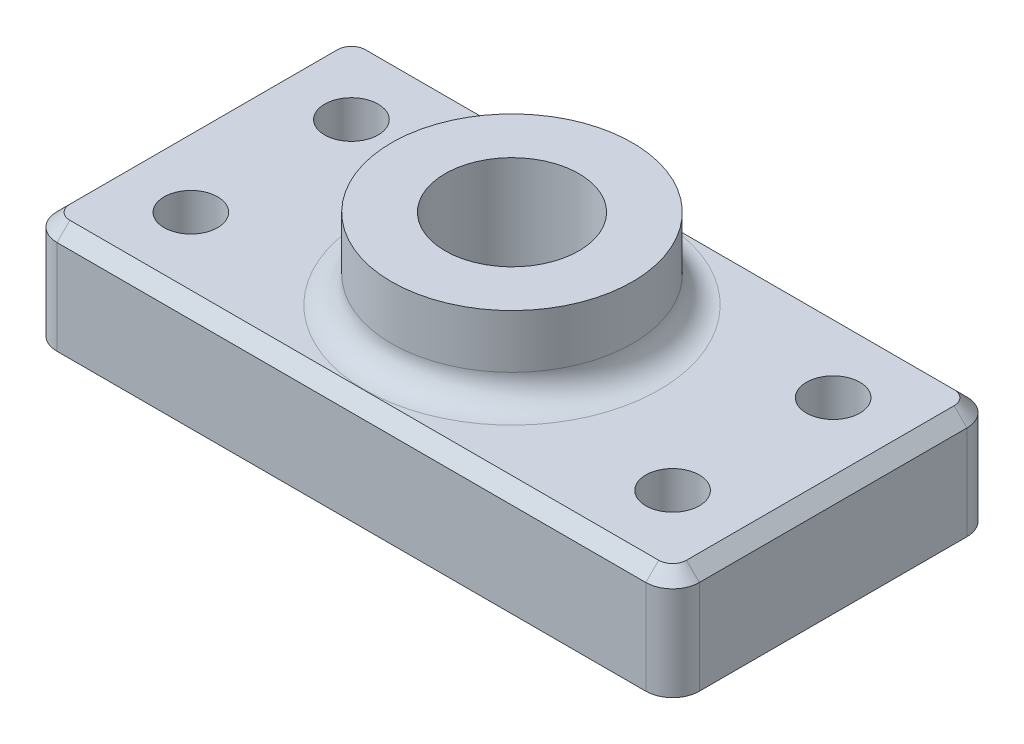
ISO-10303-21;
HEADER;
FILE_DESCRIPTION(('STEP AP214'),'2;1');
FILE_NAME('part.step','',(''),(''),'','','');
FILE_SCHEMA(('AUTOMOTIVE_DESIGN { 1 0 10303 214 1 1 1 1 }'));
ENDSEC;
DATA;
#1=APPLICATION_CONTEXT('core data for automotive mechanical design processes');
#2=APPLICATION_PROTOCOL_DEFINITION('international standard','automotive_design',2000,#1);
#3=PRODUCT_CONTEXT('',#1,'mechanical');
#4=PRODUCT('Part','Part','',(#3));
#5=PRODUCT_RELATED_PRODUCT_CATEGORY('part','',(#4));
#6=PRODUCT_DEFINITION_FORMATION('','',#4);
#7=PRODUCT_DEFINITION_CONTEXT('part definition',#1,'design');
#8=PRODUCT_DEFINITION('design','',#6,#7);
#9=PRODUCT_DEFINITION_SHAPE('','',#8);
#10=(LENGTH_UNIT() NAMED_UNIT(*) SI_UNIT(.MILLI.,.METRE.));
#11=(NAMED_UNIT(*) PLANE_ANGLE_UNIT() SI_UNIT($,.RADIAN.));
#12=(NAMED_UNIT(*) SI_UNIT($,.STERADIAN.) SOLID_ANGLE_UNIT());
#13=UNCERTAINTY_MEASURE_WITH_UNIT(LENGTH_MEASURE(1.E-05),#10,'distance_accuracy_value','');
#14=(GEOMETRIC_REPRESENTATION_CONTEXT(3) GLOBAL_UNCERTAINTY_ASSIGNED_CONTEXT((#13)) GLOBAL_UNIT_ASSIGNED_CONTEXT((#10,
#11,#12)) REPRESENTATION_CONTEXT('',''));
#15=CARTESIAN_POINT('',(0.,0.,0.));
#16=DIRECTION('',(0.,0.,1.));
#17=DIRECTION('',(1.,0.,0.));
#18=AXIS2_PLACEMENT_3D('',#15,#16,#17);
#19=CARTESIAN_POINT('',(0.,1000.,0.));
#20=DIRECTION('',(0.,1.,0.));
#21=DIRECTION('',(0.,0.,1.));
#22=AXIS2_PLACEMENT_3D('',#19,#20,#21);
#23=PLANE('',#22);
#24=CARTESIAN_POINT('',(2750.,1000.,-1250.));
#25=DIRECTION('',(0.,1.,0.));
#26=DIRECTION('',(0.,0.,1.));
#27=AXIS2_PLACEMENT_3D('',#24,#25,#26);
#28=CIRCLE('',#27,130.000000000001);
#29=CARTESIAN_POINT('',(2880.,1000.,-1250.));
#30=VERTEX_POINT('',#29);
#31=CARTESIAN_POINT('',(2750.,1000.,-1380.));
#32=VERTEX_POINT('',#31);
#33=EDGE_CURVE('E236',#30,#32,#28,.T.);
#34=ORIENTED_EDGE('',*,*,#33,.T.);
#35=DIRECTION('',(-1.,0.,0.));
#36=VECTOR('',#35,1.);
#37=CARTESIAN_POINT('',(-2750.,1000.,-1380.));
#38=LINE('',#37,#36);
#39=CARTESIAN_POINT('',(-2750.,1000.,-1380.));
#40=VERTEX_POINT('',#39);
#41=EDGE_CURVE('E242',#32,#40,#38,.T.);
#42=ORIENTED_EDGE('',*,*,#41,.T.);
#43=CARTESIAN_POINT('',(-2750.,1000.,-1250.));
#44=DIRECTION('',(0.,1.,0.));
#45=DIRECTION('',(0.,0.,1.));
#46=AXIS2_PLACEMENT_3D('',#43,#44,#45);
#47=CIRCLE('',#46,130.000000000001);
#48=CARTESIAN_POINT('',(-2880.,1000.,-1250.));
#49=VERTEX_POINT('',#48);
#50=EDGE_CURVE('E239',#40,#49,#47,.T.);
#51=ORIENTED_EDGE('',*,*,#50,.T.);
#52=DIRECTION('',(0.,0.,1.));
#53=VECTOR('',#52,1.);
#54=CARTESIAN_POINT('',(-2880.,1000.,1250.));
#55=LINE('',#54,#53);
#56=CARTESIAN_POINT('',(-2880.,1000.,1250.));
#57=VERTEX_POINT('',#56);
#58=EDGE_CURVE('E233',#49,#57,#55,.T.);
#59=ORIENTED_EDGE('',*,*,#58,.T.);
#60=CARTESIAN_POINT('',(-2750.,1000.,1250.));
#61=DIRECTION('',(0.,1.,0.));
#62=DIRECTION('',(0.,0.,1.));
#63=AXIS2_PLACEMENT_3D('',#60,#61,#62);
#64=CIRCLE('',#63,130.000000000001);
#65=CARTESIAN_POINT('',(-2750.,1000.,1380.));
#66=VERTEX_POINT('',#65);
#67=EDGE_CURVE('E227',#57,#66,#64,.T.);
#68=ORIENTED_EDGE('',*,*,#67,.T.);
#69=DIRECTION('',(1.,0.,0.));
#70=VECTOR('',#69,1.);
#71=CARTESIAN_POINT('',(2750.,1000.,1380.));
#72=LINE('',#71,#70);
#73=CARTESIAN_POINT('',(2750.,1000.,1380.));
#74=VERTEX_POINT('',#73);
#75=EDGE_CURVE('E221',#66,#74,#72,.T.);
#76=ORIENTED_EDGE('',*,*,#75,.T.);
#77=CARTESIAN_POINT('',(2750.,1000.,1250.));
#78=DIRECTION('',(0.,1.,0.));
#79=DIRECTION('',(0.,0.,1.));
#80=AXIS2_PLACEMENT_3D('',#77,#78,#79);
#81=CIRCLE('',#80,130.000000000001);
#82=CARTESIAN_POINT('',(2880.,1000.,1250.));
#83=VERTEX_POINT('',#82);
#84=EDGE_CURVE('E224',#74,#83,#81,.T.);
#85=ORIENTED_EDGE('',*,*,#84,.T.);
#86=DIRECTION('',(0.,0.,-1.));
#87=VECTOR('',#86,1.);
#88=CARTESIAN_POINT('',(2880.,1000.,-1250.));
#89=LINE('',#88,#87);
#90=EDGE_CURVE('E230',#83,#30,#89,.T.);
#91=ORIENTED_EDGE('',*,*,#90,.T.);
#92=EDGE_LOOP('',(#34,#42,#51,#59,#68,#76,#85,#91));
#93=FACE_BOUND('',#92,.T.);
#94=CARTESIAN_POINT('',(0.,1000.,0.));
#95=DIRECTION('',(0.,1.,0.));
#96=DIRECTION('',(0.,0.,1.));
#97=AXIS2_PLACEMENT_3D('',#94,#95,#96);
#98=CIRCLE('',#97,1375.);
#99=CARTESIAN_POINT('',(0.,1000.,1375.));
#100=VERTEX_POINT('',#99);
#101=EDGE_CURVE('E191',#100,#100,#98,.F.);
#102=ORIENTED_EDGE('',*,*,#101,.T.);
#103=EDGE_LOOP('',(#102));
#104=FACE_BOUND('',#103,.T.);
#105=CARTESIAN_POINT('',(-2250.,1000.,750.));
#106=DIRECTION('',(0.,1.,0.));
#107=DIRECTION('',(0.,0.,-1.));
#108=AXIS2_PLACEMENT_3D('',#105,#106,#107);
#109=CIRCLE('',#108,250.);
#110=CARTESIAN_POINT('',(-2250.,1000.,500.));
#111=VERTEX_POINT('',#110);
#112=EDGE_CURVE('E323',#111,#111,#109,.T.);
#113=ORIENTED_EDGE('',*,*,#112,.F.);
#114=EDGE_LOOP('',(#113));
#115=FACE_BOUND('',#114,.T.);
#116=CARTESIAN_POINT('',(-2250.,1000.,-750.));
#117=DIRECTION('',(0.,1.,0.));
#118=DIRECTION('',(0.,0.,1.));
#119=AXIS2_PLACEMENT_3D('',#116,#117,#118);
#120=CIRCLE('',#119,250.);
#121=CARTESIAN_POINT('',(-2250.,1000.,-500.));
#122=VERTEX_POINT('',#121);
#123=EDGE_CURVE('E169',#122,#122,#120,.T.);
#124=ORIENTED_EDGE('',*,*,#123,.F.);
#125=EDGE_LOOP('',(#124));
#126=FACE_BOUND('',#125,.T.);
#127=CARTESIAN_POINT('',(2250.,1000.,-749.999999999998));
#128=DIRECTION('',(0.,1.,0.));
#129=DIRECTION('',(0.,0.,-1.));
#130=AXIS2_PLACEMENT_3D('',#127,#128,#129);
#131=CIRCLE('',#130,250.);
#132=CARTESIAN_POINT('',(2250.,1000.,-999.999999999998));
#133=VERTEX_POINT('',#132);
#134=EDGE_CURVE('E331',#133,#133,#131,.T.);
#135=ORIENTED_EDGE('',*,*,#134,.F.);
#136=EDGE_LOOP('',(#135));
#137=FACE_BOUND('',#136,.T.);
#138=CARTESIAN_POINT('',(2250.,1000.,749.999999999998));
#139=DIRECTION('',(0.,1.,0.));
#140=DIRECTION('',(0.,0.,1.));
#141=AXIS2_PLACEMENT_3D('',#138,#139,#140);
#142=CIRCLE('',#141,250.);
#143=CARTESIAN_POINT('',(2250.,1000.,999.999999999998));
#144=VERTEX_POINT('',#143);
#145=EDGE_CURVE('E315',#144,#144,#142,.T.);
#146=ORIENTED_EDGE('',*,*,#145,.F.);
#147=EDGE_LOOP('',(#146));
#148=FACE_BOUND('',#147,.T.);
#149=ADVANCED_FACE('F44',(#93,#104,#115,#126,#137,#148),#23,.T.);
#150=CARTESIAN_POINT('',(0.,0.,0.));
#151=DIRECTION('',(0.,1.,0.));
#152=DIRECTION('',(0.,0.,1.));
#153=AXIS2_PLACEMENT_3D('',#150,#151,#152);
#154=PLANE('',#153);
#155=CARTESIAN_POINT('',(0.,0.,0.));
#156=DIRECTION('',(0.,1.,0.));
#157=DIRECTION('',(0.,0.,1.));
#158=AXIS2_PLACEMENT_3D('',#155,#156,#157);
#159=CIRCLE('',#158,625.);
#160=CARTESIAN_POINT('',(0.,0.,625.));
#161=VERTEX_POINT('',#160);
#162=EDGE_CURVE('E296',#161,#161,#159,.T.);
#163=ORIENTED_EDGE('',*,*,#162,.T.);
#164=EDGE_LOOP('',(#163));
#165=FACE_BOUND('',#164,.T.);
#166=DIRECTION('',(0.,0.,1.));
#167=VECTOR('',#166,1.);
#168=CARTESIAN_POINT('',(-3000.,0.,1500.));
#169=LINE('',#168,#167);
#170=CARTESIAN_POINT('',(-3000.,0.,-1250.));
#171=VERTEX_POINT('',#170);
#172=CARTESIAN_POINT('',(-3000.,0.,1250.));
#173=VERTEX_POINT('',#172);
#174=EDGE_CURVE('E141',#171,#173,#169,.T.);
#175=ORIENTED_EDGE('',*,*,#174,.F.);
#176=CARTESIAN_POINT('',(-2750.,0.,-1250.));
#177=DIRECTION('',(0.,1.,0.));
#178=DIRECTION('',(0.,0.,1.));
#179=AXIS2_PLACEMENT_3D('',#176,#177,#178);
#180=CIRCLE('',#179,250.);
#181=CARTESIAN_POINT('',(-2750.,0.,-1500.));
#182=VERTEX_POINT('',#181);
#183=EDGE_CURVE('E152',#171,#182,#180,.F.);
#184=ORIENTED_EDGE('',*,*,#183,.T.);
#185=DIRECTION('',(-1.,0.,0.));
#186=VECTOR('',#185,1.);
#187=CARTESIAN_POINT('',(3000.,0.,-1500.));
#188=LINE('',#187,#186);
#189=CARTESIAN_POINT('',(2750.,0.,-1500.));
#190=VERTEX_POINT('',#189);
#191=EDGE_CURVE('E184',#190,#182,#188,.T.);
#192=ORIENTED_EDGE('',*,*,#191,.F.);
#193=CARTESIAN_POINT('',(2750.,0.,-1250.));
#194=DIRECTION('',(0.,1.,0.));
#195=DIRECTION('',(0.,0.,1.));
#196=AXIS2_PLACEMENT_3D('',#193,#194,#195);
#197=CIRCLE('',#196,250.);
#198=CARTESIAN_POINT('',(3000.,0.,-1250.));
#199=VERTEX_POINT('',#198);
#200=EDGE_CURVE('E161',#190,#199,#197,.F.);
#201=ORIENTED_EDGE('',*,*,#200,.T.);
#202=DIRECTION('',(0.,0.,-1.));
#203=VECTOR('',#202,1.);
#204=CARTESIAN_POINT('',(3000.,0.,1500.));
#205=LINE('',#204,#203);
#206=CARTESIAN_POINT('',(3000.,0.,1250.));
#207=VERTEX_POINT('',#206);
#208=EDGE_CURVE('E174',#207,#199,#205,.T.);
#209=ORIENTED_EDGE('',*,*,#208,.F.);
#210=CARTESIAN_POINT('',(2750.,0.,1250.));
#211=DIRECTION('',(0.,1.,0.));
#212=DIRECTION('',(0.,0.,1.));
#213=AXIS2_PLACEMENT_3D('',#210,#211,#212);
#214=CIRCLE('',#213,250.);
#215=CARTESIAN_POINT('',(2750.,0.,1500.));
#216=VERTEX_POINT('',#215);
#217=EDGE_CURVE('E199',#207,#216,#214,.F.);
#218=ORIENTED_EDGE('',*,*,#217,.T.);
#219=DIRECTION('',(1.,0.,0.));
#220=VECTOR('',#219,1.);
#221=CARTESIAN_POINT('',(3000.,0.,1500.));
#222=LINE('',#221,#220);
#223=CARTESIAN_POINT('',(-2750.,0.,1500.));
#224=VERTEX_POINT('',#223);
#225=EDGE_CURVE('E168',#224,#216,#222,.T.);
#226=ORIENTED_EDGE('',*,*,#225,.F.);
#227=CARTESIAN_POINT('',(-2750.,0.,1250.));
#228=DIRECTION('',(0.,1.,0.));
#229=DIRECTION('',(0.,0.,1.));
#230=AXIS2_PLACEMENT_3D('',#227,#228,#229);
#231=CIRCLE('',#230,250.);
#232=EDGE_CURVE('E148',#224,#173,#231,.F.);
#233=ORIENTED_EDGE('',*,*,#232,.T.);
#234=EDGE_LOOP('',(#175,#184,#192,#201,#209,#218,#226,#233));
#235=FACE_BOUND('',#234,.T.);
#236=CARTESIAN_POINT('',(-2250.,0.,-750.));
#237=DIRECTION('',(0.,1.,0.));
#238=DIRECTION('',(0.,0.,1.));
#239=AXIS2_PLACEMENT_3D('',#236,#237,#238);
#240=CIRCLE('',#239,250.);
#241=CARTESIAN_POINT('',(-2250.,0.,-500.));
#242=VERTEX_POINT('',#241);
#243=EDGE_CURVE('E177',#242,#242,#240,.T.);
#244=ORIENTED_EDGE('',*,*,#243,.T.);
#245=EDGE_LOOP('',(#244));
#246=FACE_BOUND('',#245,.T.);
#247=CARTESIAN_POINT('',(2250.,0.,-749.999999999998));
#248=DIRECTION('',(0.,1.,0.));
#249=DIRECTION('',(0.,0.,-1.));
#250=AXIS2_PLACEMENT_3D('',#247,#248,#249);
#251=CIRCLE('',#250,250.);
#252=CARTESIAN_POINT('',(2250.,0.,-999.999999999998));
#253=VERTEX_POINT('',#252);
#254=EDGE_CURVE('E327',#253,#253,#251,.T.);
#255=ORIENTED_EDGE('',*,*,#254,.T.);
#256=EDGE_LOOP('',(#255));
#257=FACE_BOUND('',#256,.T.);
#258=CARTESIAN_POINT('',(-2250.,0.,750.));
#259=DIRECTION('',(0.,1.,0.));
#260=DIRECTION('',(0.,0.,-1.));
#261=AXIS2_PLACEMENT_3D('',#258,#259,#260);
#262=CIRCLE('',#261,250.);
#263=CARTESIAN_POINT('',(-2250.,0.,500.));
#264=VERTEX_POINT('',#263);
#265=EDGE_CURVE('E319',#264,#264,#262,.T.);
#266=ORIENTED_EDGE('',*,*,#265,.T.);
#267=EDGE_LOOP('',(#266));
#268=FACE_BOUND('',#267,.T.);
#269=CARTESIAN_POINT('',(2250.,0.,749.999999999998));
#270=DIRECTION('',(0.,1.,0.));
#271=DIRECTION('',(0.,0.,1.));
#272=AXIS2_PLACEMENT_3D('',#269,#270,#271);
#273=CIRCLE('',#272,250.);
#274=CARTESIAN_POINT('',(2250.,0.,999.999999999998));
#275=VERTEX_POINT('',#274);
#276=EDGE_CURVE('E314',#275,#275,#273,.T.);
#277=ORIENTED_EDGE('',*,*,#276,.T.);
#278=EDGE_LOOP('',(#277));
#279=FACE_BOUND('',#278,.T.);
#280=ADVANCED_FACE('F163',(#165,#235,#246,#257,#268,#279),#154,.F.);
#281=CARTESIAN_POINT('',(-3000.,1000.,1500.));
#282=DIRECTION('',(1.,0.,0.));
#283=DIRECTION('',(0.,0.,-1.));
#284=AXIS2_PLACEMENT_3D('',#281,#282,#283);
#285=PLANE('',#284);
#286=DIRECTION('',(0.,-1.,0.));
#287=VECTOR('',#286,1.);
#288=CARTESIAN_POINT('',(-3000.,1000.,1250.));
#289=LINE('',#288,#287);
#290=CARTESIAN_POINT('',(-3000.,880.000000000001,1250.));
#291=VERTEX_POINT('',#290);
#292=EDGE_CURVE('E149',#173,#291,#289,.F.);
#293=ORIENTED_EDGE('',*,*,#292,.T.);
#294=DIRECTION('',(0.,0.,-1.));
#295=VECTOR('',#294,1.);
#296=CARTESIAN_POINT('',(-3000.,880.000000000001,-1250.));
#297=LINE('',#296,#295);
#298=CARTESIAN_POINT('',(-3000.,880.000000000001,-1250.));
#299=VERTEX_POINT('',#298);
#300=EDGE_CURVE('E144',#291,#299,#297,.T.);
#301=ORIENTED_EDGE('',*,*,#300,.T.);
#302=DIRECTION('',(0.,-1.,0.));
#303=VECTOR('',#302,1.);
#304=CARTESIAN_POINT('',(-3000.,1000.,-1250.));
#305=LINE('',#304,#303);
#306=EDGE_CURVE('E136',#299,#171,#305,.T.);
#307=ORIENTED_EDGE('',*,*,#306,.T.);
#308=ORIENTED_EDGE('',*,*,#174,.T.);
#309=EDGE_LOOP('',(#293,#301,#307,#308));
#310=FACE_BOUND('',#309,.T.);
#311=ADVANCED_FACE('F139',(#310),#285,.F.);
#312=CARTESIAN_POINT('',(3000.,1000.,1500.));
#313=DIRECTION('',(0.,0.,-1.));
#314=DIRECTION('',(-1.,0.,0.));
#315=AXIS2_PLACEMENT_3D('',#312,#313,#314);
#316=PLANE('',#315);
#317=DIRECTION('',(0.,-1.,0.));
#318=VECTOR('',#317,1.);
#319=CARTESIAN_POINT('',(2750.,1000.,1500.));
#320=LINE('',#319,#318);
#321=CARTESIAN_POINT('',(2750.,880.000000000001,1500.));
#322=VERTEX_POINT('',#321);
#323=EDGE_CURVE('E218',#216,#322,#320,.F.);
#324=ORIENTED_EDGE('',*,*,#323,.T.);
#325=DIRECTION('',(-1.,0.,0.));
#326=VECTOR('',#325,1.);
#327=CARTESIAN_POINT('',(-2750.,880.000000000001,1500.));
#328=LINE('',#327,#326);
#329=CARTESIAN_POINT('',(-2750.,880.000000000001,1500.));
#330=VERTEX_POINT('',#329);
#331=EDGE_CURVE('E11',#322,#330,#328,.T.);
#332=ORIENTED_EDGE('',*,*,#331,.T.);
#333=DIRECTION('',(0.,-1.,0.));
#334=VECTOR('',#333,1.);
#335=CARTESIAN_POINT('',(-2750.,1000.,1500.));
#336=LINE('',#335,#334);
#337=EDGE_CURVE('E215',#330,#224,#336,.T.);
#338=ORIENTED_EDGE('',*,*,#337,.T.);
#339=ORIENTED_EDGE('',*,*,#225,.T.);
#340=EDGE_LOOP('',(#324,#332,#338,#339));
#341=FACE_BOUND('',#340,.T.);
#342=ADVANCED_FACE('F373',(#341),#316,.F.);
#343=CARTESIAN_POINT('',(3000.,1000.,1500.));
#344=DIRECTION('',(-1.,0.,0.));
#345=DIRECTION('',(0.,0.,1.));
#346=AXIS2_PLACEMENT_3D('',#343,#344,#345);
#347=PLANE('',#346);
#348=DIRECTION('',(0.,-1.,0.));
#349=VECTOR('',#348,1.);
#350=CARTESIAN_POINT('',(3000.,1000.,-1250.));
#351=LINE('',#350,#349);
#352=CARTESIAN_POINT('',(3000.,880.000000000001,-1250.));
#353=VERTEX_POINT('',#352);
#354=EDGE_CURVE('E211',#199,#353,#351,.F.);
#355=ORIENTED_EDGE('',*,*,#354,.T.);
#356=DIRECTION('',(0.,0.,1.));
#357=VECTOR('',#356,1.);
#358=CARTESIAN_POINT('',(3000.,880.000000000001,1250.));
#359=LINE('',#358,#357);
#360=CARTESIAN_POINT('',(3000.,880.000000000001,1250.));
#361=VERTEX_POINT('',#360);
#362=EDGE_CURVE('E258',#353,#361,#359,.T.);
#363=ORIENTED_EDGE('',*,*,#362,.T.);
#364=DIRECTION('',(0.,-1.,0.));
#365=VECTOR('',#364,1.);
#366=CARTESIAN_POINT('',(3000.,1000.,1250.));
#367=LINE('',#366,#365);
#368=EDGE_CURVE('E208',#361,#207,#367,.T.);
#369=ORIENTED_EDGE('',*,*,#368,.T.);
#370=ORIENTED_EDGE('',*,*,#208,.T.);
#371=EDGE_LOOP('',(#355,#363,#369,#370));
#372=FACE_BOUND('',#371,.T.);
#373=ADVANCED_FACE('F369',(#372),#347,.F.);
#374=CARTESIAN_POINT('',(3000.,1000.,-1500.));
#375=DIRECTION('',(0.,0.,1.));
#376=DIRECTION('',(1.,0.,0.));
#377=AXIS2_PLACEMENT_3D('',#374,#375,#376);
#378=PLANE('',#377);
#379=DIRECTION('',(0.,-1.,0.));
#380=VECTOR('',#379,1.);
#381=CARTESIAN_POINT('',(-2750.,1000.,-1500.));
#382=LINE('',#381,#380);
#383=CARTESIAN_POINT('',(-2750.,880.000000000001,-1500.));
#384=VERTEX_POINT('',#383);
#385=EDGE_CURVE('E155',#182,#384,#382,.F.);
#386=ORIENTED_EDGE('',*,*,#385,.T.);
#387=DIRECTION('',(1.,0.,0.));
#388=VECTOR('',#387,1.);
#389=CARTESIAN_POINT('',(2750.,880.000000000001,-1500.));
#390=LINE('',#389,#388);
#391=CARTESIAN_POINT('',(2750.,880.000000000001,-1500.));
#392=VERTEX_POINT('',#391);
#393=EDGE_CURVE('E246',#384,#392,#390,.T.);
#394=ORIENTED_EDGE('',*,*,#393,.T.);
#395=DIRECTION('',(0.,-1.,0.));
#396=VECTOR('',#395,1.);
#397=CARTESIAN_POINT('',(2750.,1000.,-1500.));
#398=LINE('',#397,#396);
#399=EDGE_CURVE('E160',#392,#190,#398,.T.);
#400=ORIENTED_EDGE('',*,*,#399,.T.);
#401=ORIENTED_EDGE('',*,*,#191,.T.);
#402=EDGE_LOOP('',(#386,#394,#400,#401));
#403=FACE_BOUND('',#402,.T.);
#404=ADVANCED_FACE('F354',(#403),#378,.F.);
#405=CARTESIAN_POINT('',(-2250.,1000.,-750.));
#406=DIRECTION('',(0.,-1.,0.));
#407=DIRECTION('',(0.,0.,-1.));
#408=AXIS2_PLACEMENT_3D('',#405,#406,#407);
#409=CYLINDRICAL_SURFACE('',#408,250.);
#410=ORIENTED_EDGE('',*,*,#123,.T.);
#411=EDGE_LOOP('',(#410));
#412=FACE_BOUND('',#411,.T.);
#413=ORIENTED_EDGE('',*,*,#243,.F.);
#414=EDGE_LOOP('',(#413));
#415=FACE_BOUND('',#414,.T.);
#416=ADVANCED_FACE('F344',(#412,#415),#409,.F.);
#417=CARTESIAN_POINT('',(2250.,1000.,-749.999999999998));
#418=DIRECTION('',(0.,-1.,0.));
#419=DIRECTION('',(0.,0.,-1.));
#420=AXIS2_PLACEMENT_3D('',#417,#418,#419);
#421=CYLINDRICAL_SURFACE('',#420,250.);
#422=ORIENTED_EDGE('',*,*,#134,.T.);
#423=EDGE_LOOP('',(#422));
#424=FACE_BOUND('',#423,.T.);
#425=ORIENTED_EDGE('',*,*,#254,.F.);
#426=EDGE_LOOP('',(#425));
#427=FACE_BOUND('',#426,.T.);
#428=ADVANCED_FACE('F341',(#424,#427),#421,.F.);
#429=CARTESIAN_POINT('',(-2250.,1000.,750.));
#430=DIRECTION('',(0.,-1.,0.));
#431=DIRECTION('',(0.,0.,-1.));
#432=AXIS2_PLACEMENT_3D('',#429,#430,#431);
#433=CYLINDRICAL_SURFACE('',#432,250.);
#434=ORIENTED_EDGE('',*,*,#112,.T.);
#435=EDGE_LOOP('',(#434));
#436=FACE_BOUND('',#435,.T.);
#437=ORIENTED_EDGE('',*,*,#265,.F.);
#438=EDGE_LOOP('',(#437));
#439=FACE_BOUND('',#438,.T.);
#440=ADVANCED_FACE('F343',(#436,#439),#433,.F.);
#441=CARTESIAN_POINT('',(2250.,1000.,749.999999999998));
#442=DIRECTION('',(0.,-1.,0.));
#443=DIRECTION('',(0.,0.,-1.));
#444=AXIS2_PLACEMENT_3D('',#441,#442,#443);
#445=CYLINDRICAL_SURFACE('',#444,250.);
#446=ORIENTED_EDGE('',*,*,#145,.T.);
#447=EDGE_LOOP('',(#446));
#448=FACE_BOUND('',#447,.T.);
#449=ORIENTED_EDGE('',*,*,#276,.F.);
#450=EDGE_LOOP('',(#449));
#451=FACE_BOUND('',#450,.T.);
#452=ADVANCED_FACE('F351',(#448,#451),#445,.F.);
#453=CARTESIAN_POINT('',(0.,1750.,0.));
#454=DIRECTION('',(0.,1.,0.));
#455=DIRECTION('',(0.,0.,1.));
#456=AXIS2_PLACEMENT_3D('',#453,#454,#455);
#457=PLANE('',#456);
#458=CARTESIAN_POINT('',(0.,1750.,0.));
#459=DIRECTION('',(0.,1.,0.));
#460=DIRECTION('',(0.,0.,1.));
#461=AXIS2_PLACEMENT_3D('',#458,#459,#460);
#462=CIRCLE('',#461,1125.);
#463=CARTESIAN_POINT('',(0.,1750.,1125.));
#464=VERTEX_POINT('',#463);
#465=EDGE_CURVE('E308',#464,#464,#462,.T.);
#466=ORIENTED_EDGE('',*,*,#465,.T.);
#467=EDGE_LOOP('',(#466));
#468=FACE_BOUND('',#467,.T.);
#469=CARTESIAN_POINT('',(0.,1750.,0.));
#470=DIRECTION('',(0.,1.,0.));
#471=DIRECTION('',(0.,0.,1.));
#472=AXIS2_PLACEMENT_3D('',#469,#470,#471);
#473=CIRCLE('',#472,625.);
#474=CARTESIAN_POINT('',(0.,1750.,625.));
#475=VERTEX_POINT('',#474);
#476=EDGE_CURVE('E302',#475,#475,#473,.T.);
#477=ORIENTED_EDGE('',*,*,#476,.F.);
#478=EDGE_LOOP('',(#477));
#479=FACE_BOUND('',#478,.T.);
#480=ADVANCED_FACE('F503',(#468,#479),#457,.T.);
#481=CARTESIAN_POINT('',(0.,1750.,0.));
#482=DIRECTION('',(0.,-1.,0.));
#483=DIRECTION('',(0.,0.,-1.));
#484=AXIS2_PLACEMENT_3D('',#481,#482,#483);
#485=CYLINDRICAL_SURFACE('',#484,1125.);
#486=CARTESIAN_POINT('',(0.,1250.,0.));
#487=DIRECTION('',(0.,1.,0.));
#488=DIRECTION('',(0.,0.,1.));
#489=AXIS2_PLACEMENT_3D('',#486,#487,#488);
#490=CIRCLE('',#489,1125.);
#491=CARTESIAN_POINT('',(0.,1250.,1125.));
#492=VERTEX_POINT('',#491);
#493=EDGE_CURVE('E187',#492,#492,#490,.T.);
#494=ORIENTED_EDGE('',*,*,#493,.T.);
#495=EDGE_LOOP('',(#494));
#496=FACE_BOUND('',#495,.T.);
#497=ORIENTED_EDGE('',*,*,#465,.F.);
#498=EDGE_LOOP('',(#497));
#499=FACE_BOUND('',#498,.T.);
#500=ADVANCED_FACE('F494',(#496,#499),#485,.T.);
#501=CARTESIAN_POINT('',(0.,1750.,0.));
#502=DIRECTION('',(0.,-1.,0.));
#503=DIRECTION('',(0.,0.,-1.));
#504=AXIS2_PLACEMENT_3D('',#501,#502,#503);
#505=CYLINDRICAL_SURFACE('',#504,625.);
#506=ORIENTED_EDGE('',*,*,#476,.T.);
#507=EDGE_LOOP('',(#506));
#508=FACE_BOUND('',#507,.T.);
#509=ORIENTED_EDGE('',*,*,#162,.F.);
#510=EDGE_LOOP('',(#509));
#511=FACE_BOUND('',#510,.T.);
#512=ADVANCED_FACE('F381',(#508,#511),#505,.F.);
#513=CARTESIAN_POINT('',(0.,1250.,0.));
#514=DIRECTION('',(0.,1.,0.));
#515=DIRECTION('',(0.,0.,1.));
#516=AXIS2_PLACEMENT_3D('',#513,#514,#515);
#517=TOROIDAL_SURFACE('',#516,1375.,250.);
#518=ORIENTED_EDGE('',*,*,#101,.F.);
#519=EDGE_LOOP('',(#518));
#520=FACE_BOUND('',#519,.T.);
#521=ORIENTED_EDGE('',*,*,#493,.F.);
#522=EDGE_LOOP('',(#521));
#523=FACE_BOUND('',#522,.T.);
#524=ADVANCED_FACE('F378',(#520,#523),#517,.F.);
#525=CARTESIAN_POINT('',(-2750.,1000.,-1250.));
#526=DIRECTION('',(0.,-1.,0.));
#527=DIRECTION('',(0.,0.,-1.));
#528=AXIS2_PLACEMENT_3D('',#525,#526,#527);
#529=CYLINDRICAL_SURFACE('',#528,250.);
#530=ORIENTED_EDGE('',*,*,#306,.F.);
#531=CARTESIAN_POINT('',(-2750.,880.000000000001,-1250.));
#532=DIRECTION('',(0.,1.,0.));
#533=DIRECTION('',(0.,0.,1.));
#534=AXIS2_PLACEMENT_3D('',#531,#532,#533);
#535=CIRCLE('',#534,250.);
#536=EDGE_CURVE('E250',#299,#384,#535,.F.);
#537=ORIENTED_EDGE('',*,*,#536,.T.);
#538=ORIENTED_EDGE('',*,*,#385,.F.);
#539=ORIENTED_EDGE('',*,*,#183,.F.);
#540=EDGE_LOOP('',(#530,#537,#538,#539));
#541=FACE_BOUND('',#540,.T.);
#542=ADVANCED_FACE('F153',(#541),#529,.T.);
#543=CARTESIAN_POINT('',(2750.,1000.,-1250.));
#544=DIRECTION('',(0.,-1.,0.));
#545=DIRECTION('',(0.,0.,-1.));
#546=AXIS2_PLACEMENT_3D('',#543,#544,#545);
#547=CYLINDRICAL_SURFACE('',#546,250.);
#548=ORIENTED_EDGE('',*,*,#399,.F.);
#549=CARTESIAN_POINT('',(2750.,880.000000000001,-1250.));
#550=DIRECTION('',(0.,1.,0.));
#551=DIRECTION('',(0.,0.,1.));
#552=AXIS2_PLACEMENT_3D('',#549,#550,#551);
#553=CIRCLE('',#552,250.);
#554=EDGE_CURVE('E253',#392,#353,#553,.F.);
#555=ORIENTED_EDGE('',*,*,#554,.T.);
#556=ORIENTED_EDGE('',*,*,#354,.F.);
#557=ORIENTED_EDGE('',*,*,#200,.F.);
#558=EDGE_LOOP('',(#548,#555,#556,#557));
#559=FACE_BOUND('',#558,.T.);
#560=ADVANCED_FACE('F385',(#559),#547,.T.);
#561=CARTESIAN_POINT('',(2750.,1000.,1250.));
#562=DIRECTION('',(0.,-1.,0.));
#563=DIRECTION('',(0.,0.,-1.));
#564=AXIS2_PLACEMENT_3D('',#561,#562,#563);
#565=CYLINDRICAL_SURFACE('',#564,250.);
#566=ORIENTED_EDGE('',*,*,#368,.F.);
#567=CARTESIAN_POINT('',(2750.,880.000000000001,1250.));
#568=DIRECTION('',(0.,1.,0.));
#569=DIRECTION('',(0.,0.,1.));
#570=AXIS2_PLACEMENT_3D('',#567,#568,#569);
#571=CIRCLE('',#570,250.);
#572=EDGE_CURVE('E55',#361,#322,#571,.F.);
#573=ORIENTED_EDGE('',*,*,#572,.T.);
#574=ORIENTED_EDGE('',*,*,#323,.F.);
#575=ORIENTED_EDGE('',*,*,#217,.F.);
#576=EDGE_LOOP('',(#566,#573,#574,#575));
#577=FACE_BOUND('',#576,.T.);
#578=ADVANCED_FACE('F388',(#577),#565,.T.);
#579=CARTESIAN_POINT('',(-2750.,1000.,1250.));
#580=DIRECTION('',(0.,-1.,0.));
#581=DIRECTION('',(0.,0.,-1.));
#582=AXIS2_PLACEMENT_3D('',#579,#580,#581);
#583=CYLINDRICAL_SURFACE('',#582,250.);
#584=ORIENTED_EDGE('',*,*,#337,.F.);
#585=CARTESIAN_POINT('',(-2750.,880.000000000001,1250.));
#586=DIRECTION('',(0.,1.,0.));
#587=DIRECTION('',(0.,0.,1.));
#588=AXIS2_PLACEMENT_3D('',#585,#586,#587);
#589=CIRCLE('',#588,250.);
#590=EDGE_CURVE('E261',#330,#291,#589,.F.);
#591=ORIENTED_EDGE('',*,*,#590,.T.);
#592=ORIENTED_EDGE('',*,*,#292,.F.);
#593=ORIENTED_EDGE('',*,*,#232,.F.);
#594=EDGE_LOOP('',(#584,#591,#592,#593));
#595=FACE_BOUND('',#594,.T.);
#596=ADVANCED_FACE('F392',(#595),#583,.T.);
#597=CARTESIAN_POINT('',(1.53210777398272E-13,1000.,1380.));
#598=DIRECTION('',(0.,0.707106781186548,0.707106781186547));
#599=DIRECTION('',(-1.,0.,0.));
#600=AXIS2_PLACEMENT_3D('',#597,#598,#599);
#601=PLANE('',#600);
#602=DIRECTION('',(0.,0.707106781186548,-0.707106781186548));
#603=VECTOR('',#602,1.);
#604=CARTESIAN_POINT('',(-2750.,880.000000000001,1500.));
#605=LINE('',#604,#603);
#606=EDGE_CURVE('E287',#330,#66,#605,.T.);
#607=ORIENTED_EDGE('',*,*,#606,.F.);
#608=ORIENTED_EDGE('',*,*,#331,.F.);
#609=DIRECTION('',(0.,-0.707106781186548,0.707106781186548));
#610=VECTOR('',#609,1.);
#611=CARTESIAN_POINT('',(2750.,1000.,1380.));
#612=LINE('',#611,#610);
#613=EDGE_CURVE('E49',#74,#322,#612,.T.);
#614=ORIENTED_EDGE('',*,*,#613,.F.);
#615=ORIENTED_EDGE('',*,*,#75,.F.);
#616=EDGE_LOOP('',(#607,#608,#614,#615));
#617=FACE_BOUND('',#616,.T.);
#618=ADVANCED_FACE('F47',(#617),#601,.T.);
#619=CARTESIAN_POINT('',(2750.,1000.,1250.));
#620=DIRECTION('',(0.,-1.,0.));
#621=DIRECTION('',(0.,0.,-1.));
#622=AXIS2_PLACEMENT_3D('',#619,#620,#621);
#623=CONICAL_SURFACE('',#622,130.000000000001,0.785398163397448);
#624=ORIENTED_EDGE('',*,*,#613,.T.);
#625=ORIENTED_EDGE('',*,*,#572,.F.);
#626=DIRECTION('',(0.707106781186548,-0.707106781186548,0.));
#627=VECTOR('',#626,1.);
#628=CARTESIAN_POINT('',(2880.,1000.,1250.));
#629=LINE('',#628,#627);
#630=EDGE_CURVE('E284',#83,#361,#629,.T.);
#631=ORIENTED_EDGE('',*,*,#630,.F.);
#632=ORIENTED_EDGE('',*,*,#84,.F.);
#633=EDGE_LOOP('',(#624,#625,#631,#632));
#634=FACE_BOUND('',#633,.T.);
#635=ADVANCED_FACE('F437',(#634),#623,.T.);
#636=CARTESIAN_POINT('',(-2750.,1000.,1250.));
#637=DIRECTION('',(0.,-1.,0.));
#638=DIRECTION('',(0.,0.,-1.));
#639=AXIS2_PLACEMENT_3D('',#636,#637,#638);
#640=CONICAL_SURFACE('',#639,130.000000000001,0.785398163397448);
#641=ORIENTED_EDGE('',*,*,#606,.T.);
#642=ORIENTED_EDGE('',*,*,#67,.F.);
#643=DIRECTION('',(0.707106781186548,0.707106781186548,0.));
#644=VECTOR('',#643,1.);
#645=CARTESIAN_POINT('',(-3000.,880.000000000001,1250.));
#646=LINE('',#645,#644);
#647=EDGE_CURVE('E280',#291,#57,#646,.T.);
#648=ORIENTED_EDGE('',*,*,#647,.F.);
#649=ORIENTED_EDGE('',*,*,#590,.F.);
#650=EDGE_LOOP('',(#641,#642,#648,#649));
#651=FACE_BOUND('',#650,.T.);
#652=ADVANCED_FACE('F431',(#651),#640,.T.);
#653=CARTESIAN_POINT('',(2880.,1000.,0.));
#654=DIRECTION('',(0.707106781186548,0.707106781186548,0.));
#655=DIRECTION('',(0.,0.,1.));
#656=AXIS2_PLACEMENT_3D('',#653,#654,#655);
#657=PLANE('',#656);
#658=ORIENTED_EDGE('',*,*,#630,.T.);
#659=ORIENTED_EDGE('',*,*,#362,.F.);
#660=DIRECTION('',(0.707106781186548,-0.707106781186548,0.));
#661=VECTOR('',#660,1.);
#662=CARTESIAN_POINT('',(2880.,1000.,-1250.));
#663=LINE('',#662,#661);
#664=EDGE_CURVE('E276',#30,#353,#663,.T.);
#665=ORIENTED_EDGE('',*,*,#664,.F.);
#666=ORIENTED_EDGE('',*,*,#90,.F.);
#667=EDGE_LOOP('',(#658,#659,#665,#666));
#668=FACE_BOUND('',#667,.T.);
#669=ADVANCED_FACE('F424',(#668),#657,.T.);
#670=CARTESIAN_POINT('',(-2880.,1000.,0.));
#671=DIRECTION('',(-0.707106781186548,0.707106781186548,0.));
#672=DIRECTION('',(0.,0.,-1.));
#673=AXIS2_PLACEMENT_3D('',#670,#671,#672);
#674=PLANE('',#673);
#675=ORIENTED_EDGE('',*,*,#647,.T.);
#676=ORIENTED_EDGE('',*,*,#58,.F.);
#677=DIRECTION('',(0.707106781186548,0.707106781186548,0.));
#678=VECTOR('',#677,1.);
#679=CARTESIAN_POINT('',(-3000.,880.000000000001,-1250.));
#680=LINE('',#679,#678);
#681=EDGE_CURVE('E272',#299,#49,#680,.T.);
#682=ORIENTED_EDGE('',*,*,#681,.F.);
#683=ORIENTED_EDGE('',*,*,#300,.F.);
#684=EDGE_LOOP('',(#675,#676,#682,#683));
#685=FACE_BOUND('',#684,.T.);
#686=ADVANCED_FACE('F417',(#685),#674,.T.);
#687=CARTESIAN_POINT('',(2750.,1000.,-1250.));
#688=DIRECTION('',(0.,-1.,0.));
#689=DIRECTION('',(0.,0.,-1.));
#690=AXIS2_PLACEMENT_3D('',#687,#688,#689);
#691=CONICAL_SURFACE('',#690,130.000000000001,0.785398163397448);
#692=ORIENTED_EDGE('',*,*,#664,.T.);
#693=ORIENTED_EDGE('',*,*,#554,.F.);
#694=DIRECTION('',(0.,-0.707106781186548,-0.707106781186548));
#695=VECTOR('',#694,1.);
#696=CARTESIAN_POINT('',(2750.,1000.,-1380.));
#697=LINE('',#696,#695);
#698=EDGE_CURVE('E269',#32,#392,#697,.T.);
#699=ORIENTED_EDGE('',*,*,#698,.F.);
#700=ORIENTED_EDGE('',*,*,#33,.F.);
#701=EDGE_LOOP('',(#692,#693,#699,#700));
#702=FACE_BOUND('',#701,.T.);
#703=ADVANCED_FACE('F410',(#702),#691,.T.);
#704=CARTESIAN_POINT('',(-2750.,1000.,-1250.));
#705=DIRECTION('',(0.,-1.,0.));
#706=DIRECTION('',(0.,0.,-1.));
#707=AXIS2_PLACEMENT_3D('',#704,#705,#706);
#708=CONICAL_SURFACE('',#707,130.000000000001,0.785398163397448);
#709=ORIENTED_EDGE('',*,*,#681,.T.);
#710=ORIENTED_EDGE('',*,*,#50,.F.);
#711=DIRECTION('',(0.,0.707106781186548,0.707106781186548));
#712=VECTOR('',#711,1.);
#713=CARTESIAN_POINT('',(-2750.,880.000000000001,-1500.));
#714=LINE('',#713,#712);
#715=EDGE_CURVE('E266',#384,#40,#714,.T.);
#716=ORIENTED_EDGE('',*,*,#715,.F.);
#717=ORIENTED_EDGE('',*,*,#536,.F.);
#718=EDGE_LOOP('',(#709,#710,#716,#717));
#719=FACE_BOUND('',#718,.T.);
#720=ADVANCED_FACE('F403',(#719),#708,.T.);
#721=CARTESIAN_POINT('',(-2.04281036531029E-13,1000.,-1380.));
#722=DIRECTION('',(0.,0.707106781186548,-0.707106781186548));
#723=DIRECTION('',(1.,0.,0.));
#724=AXIS2_PLACEMENT_3D('',#721,#722,#723);
#725=PLANE('',#724);
#726=ORIENTED_EDGE('',*,*,#698,.T.);
#727=ORIENTED_EDGE('',*,*,#393,.F.);
#728=ORIENTED_EDGE('',*,*,#715,.T.);
#729=ORIENTED_EDGE('',*,*,#41,.F.);
#730=EDGE_LOOP('',(#726,#727,#728,#729));
#731=FACE_BOUND('',#730,.T.);
#732=ADVANCED_FACE('F397',(#731),#725,.T.);
#733=CLOSED_SHELL('',(#149,#280,#311,#342,#373,#404,#416,#428,#440,#452,#480,#500,#512,#524,
#542,#560,#578,#596,#618,#635,#652,#669,#686,#703,#720,#732));
#734=MANIFOLD_SOLID_BREP('B2',#733);
#735=ADVANCED_BREP_SHAPE_REPRESENTATION('',(#18,#734),#14);
#736=SHAPE_DEFINITION_REPRESENTATION(#9,#735);
ENDSEC;
END-ISO-10303-21;
